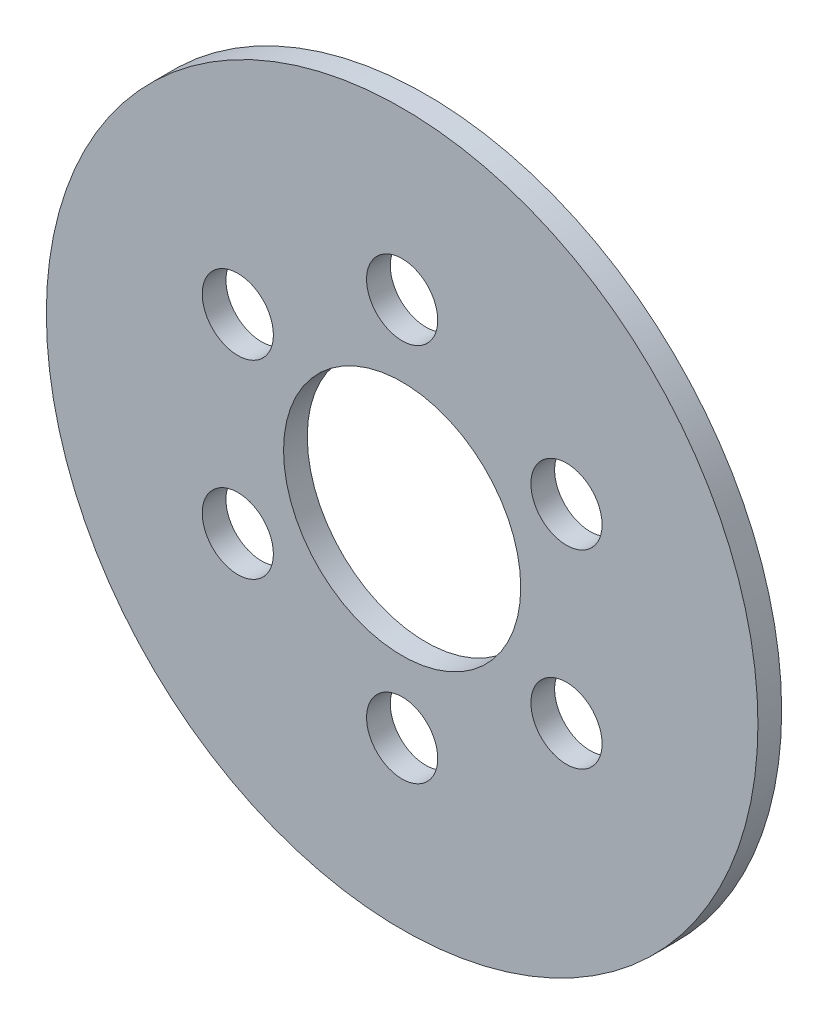
ISO-10303-21;
HEADER;
FILE_DESCRIPTION(('STEP AP214'),'2;1');
FILE_NAME('part.step','',(''),(''),'','','');
FILE_SCHEMA(('AUTOMOTIVE_DESIGN { 1 0 10303 214 1 1 1 1 }'));
ENDSEC;
DATA;
#1=APPLICATION_CONTEXT('core data for automotive mechanical design processes');
#2=APPLICATION_PROTOCOL_DEFINITION('international standard','automotive_design',2000,#1);
#3=PRODUCT_CONTEXT('',#1,'mechanical');
#4=PRODUCT('Part','Part','',(#3));
#5=PRODUCT_RELATED_PRODUCT_CATEGORY('part','',(#4));
#6=PRODUCT_DEFINITION_FORMATION('','',#4);
#7=PRODUCT_DEFINITION_CONTEXT('part definition',#1,'design');
#8=PRODUCT_DEFINITION('design','',#6,#7);
#9=PRODUCT_DEFINITION_SHAPE('','',#8);
#10=(LENGTH_UNIT() NAMED_UNIT(*) SI_UNIT(.MILLI.,.METRE.));
#11=(NAMED_UNIT(*) PLANE_ANGLE_UNIT() SI_UNIT($,.RADIAN.));
#12=(NAMED_UNIT(*) SI_UNIT($,.STERADIAN.) SOLID_ANGLE_UNIT());
#13=UNCERTAINTY_MEASURE_WITH_UNIT(LENGTH_MEASURE(1.E-05),#10,'distance_accuracy_value','');
#14=(GEOMETRIC_REPRESENTATION_CONTEXT(3) GLOBAL_UNCERTAINTY_ASSIGNED_CONTEXT((#13)) GLOBAL_UNIT_ASSIGNED_CONTEXT((#10,
#11,#12)) REPRESENTATION_CONTEXT('',''));
#15=CARTESIAN_POINT('',(0.,0.,0.));
#16=DIRECTION('',(0.,0.,1.));
#17=DIRECTION('',(1.,0.,0.));
#18=AXIS2_PLACEMENT_3D('',#15,#16,#17);
#19=CARTESIAN_POINT('',(0.,0.,1.));
#20=DIRECTION('',(0.,0.,1.));
#21=DIRECTION('',(1.,0.,0.));
#22=AXIS2_PLACEMENT_3D('',#19,#20,#21);
#23=PLANE('',#22);
#24=CARTESIAN_POINT('',(-6.92820323027551,3.99999999999999,1.));
#25=DIRECTION('',(0.,0.,1.));
#26=DIRECTION('',(1.,0.,0.));
#27=AXIS2_PLACEMENT_3D('',#24,#25,#26);
#28=CIRCLE('',#27,1.5);
#29=CARTESIAN_POINT('',(-5.42820323027551,3.99999999999999,1.));
#30=VERTEX_POINT('',#29);
#31=EDGE_CURVE('E73',#30,#30,#28,.T.);
#32=ORIENTED_EDGE('',*,*,#31,.F.);
#33=EDGE_LOOP('',(#32));
#34=FACE_BOUND('',#33,.T.);
#35=CARTESIAN_POINT('',(0.,-8.,1.));
#36=DIRECTION('',(0.,0.,1.));
#37=DIRECTION('',(1.,0.,0.));
#38=AXIS2_PLACEMENT_3D('',#35,#36,#37);
#39=CIRCLE('',#38,1.5);
#40=CARTESIAN_POINT('',(1.5,-8.,1.));
#41=VERTEX_POINT('',#40);
#42=EDGE_CURVE('E61',#41,#41,#39,.T.);
#43=ORIENTED_EDGE('',*,*,#42,.F.);
#44=EDGE_LOOP('',(#43));
#45=FACE_BOUND('',#44,.T.);
#46=CARTESIAN_POINT('',(6.92820323027551,4.,1.));
#47=DIRECTION('',(0.,0.,1.));
#48=DIRECTION('',(1.,0.,0.));
#49=AXIS2_PLACEMENT_3D('',#46,#47,#48);
#50=CIRCLE('',#49,1.5);
#51=CARTESIAN_POINT('',(8.42820323027551,4.,1.));
#52=VERTEX_POINT('',#51);
#53=EDGE_CURVE('E49',#52,#52,#50,.T.);
#54=ORIENTED_EDGE('',*,*,#53,.F.);
#55=EDGE_LOOP('',(#54));
#56=FACE_BOUND('',#55,.T.);
#57=CARTESIAN_POINT('',(0.,0.,1.));
#58=DIRECTION('',(0.,0.,1.));
#59=DIRECTION('',(1.,0.,0.));
#60=AXIS2_PLACEMENT_3D('',#57,#58,#59);
#61=CIRCLE('',#60,15.);
#62=CARTESIAN_POINT('',(15.,0.,1.));
#63=VERTEX_POINT('',#62);
#64=EDGE_CURVE('E10',#63,#63,#61,.T.);
#65=ORIENTED_EDGE('',*,*,#64,.T.);
#66=EDGE_LOOP('',(#65));
#67=FACE_BOUND('',#66,.T.);
#68=CARTESIAN_POINT('',(0.,8.,1.));
#69=DIRECTION('',(0.,0.,1.));
#70=DIRECTION('',(1.,0.,0.));
#71=AXIS2_PLACEMENT_3D('',#68,#69,#70);
#72=CIRCLE('',#71,1.5);
#73=CARTESIAN_POINT('',(1.5,8.,1.));
#74=VERTEX_POINT('',#73);
#75=EDGE_CURVE('E44',#74,#74,#72,.T.);
#76=ORIENTED_EDGE('',*,*,#75,.F.);
#77=EDGE_LOOP('',(#76));
#78=FACE_BOUND('',#77,.T.);
#79=CARTESIAN_POINT('',(6.92820323027551,-4.,1.));
#80=DIRECTION('',(0.,0.,1.));
#81=DIRECTION('',(1.,0.,0.));
#82=AXIS2_PLACEMENT_3D('',#79,#80,#81);
#83=CIRCLE('',#82,1.5);
#84=CARTESIAN_POINT('',(8.42820323027551,-4.,1.));
#85=VERTEX_POINT('',#84);
#86=EDGE_CURVE('E55',#85,#85,#83,.T.);
#87=ORIENTED_EDGE('',*,*,#86,.F.);
#88=EDGE_LOOP('',(#87));
#89=FACE_BOUND('',#88,.T.);
#90=CARTESIAN_POINT('',(-6.92820323027551,-4.,1.));
#91=DIRECTION('',(0.,0.,1.));
#92=DIRECTION('',(1.,0.,0.));
#93=AXIS2_PLACEMENT_3D('',#90,#91,#92);
#94=CIRCLE('',#93,1.5);
#95=CARTESIAN_POINT('',(-5.42820323027551,-4.,1.));
#96=VERTEX_POINT('',#95);
#97=EDGE_CURVE('E67',#96,#96,#94,.T.);
#98=ORIENTED_EDGE('',*,*,#97,.F.);
#99=EDGE_LOOP('',(#98));
#100=FACE_BOUND('',#99,.T.);
#101=CARTESIAN_POINT('',(0.,0.,1.));
#102=DIRECTION('',(0.,0.,1.));
#103=DIRECTION('',(1.,0.,0.));
#104=AXIS2_PLACEMENT_3D('',#101,#102,#103);
#105=CIRCLE('',#104,5.);
#106=CARTESIAN_POINT('',(5.,0.,1.));
#107=VERTEX_POINT('',#106);
#108=EDGE_CURVE('E79',#107,#107,#105,.T.);
#109=ORIENTED_EDGE('',*,*,#108,.F.);
#110=EDGE_LOOP('',(#109));
#111=FACE_BOUND('',#110,.T.);
#112=ADVANCED_FACE('F33',(#34,#45,#56,#67,#78,#89,#100,#111),#23,.T.);
#113=CARTESIAN_POINT('',(0.,0.,0.));
#114=DIRECTION('',(0.,0.,1.));
#115=DIRECTION('',(1.,0.,0.));
#116=AXIS2_PLACEMENT_3D('',#113,#114,#115);
#117=PLANE('',#116);
#118=CARTESIAN_POINT('',(0.,0.,0.));
#119=DIRECTION('',(0.,0.,1.));
#120=DIRECTION('',(1.,0.,0.));
#121=AXIS2_PLACEMENT_3D('',#118,#119,#120);
#122=CIRCLE('',#121,15.);
#123=CARTESIAN_POINT('',(15.,0.,0.));
#124=VERTEX_POINT('',#123);
#125=EDGE_CURVE('E37',#124,#124,#122,.T.);
#126=ORIENTED_EDGE('',*,*,#125,.F.);
#127=EDGE_LOOP('',(#126));
#128=FACE_BOUND('',#127,.T.);
#129=CARTESIAN_POINT('',(0.,8.,0.));
#130=DIRECTION('',(0.,0.,1.));
#131=DIRECTION('',(1.,0.,0.));
#132=AXIS2_PLACEMENT_3D('',#129,#130,#131);
#133=CIRCLE('',#132,1.5);
#134=CARTESIAN_POINT('',(1.5,8.,0.));
#135=VERTEX_POINT('',#134);
#136=EDGE_CURVE('E46',#135,#135,#133,.T.);
#137=ORIENTED_EDGE('',*,*,#136,.T.);
#138=EDGE_LOOP('',(#137));
#139=FACE_BOUND('',#138,.T.);
#140=CARTESIAN_POINT('',(6.92820323027551,4.,0.));
#141=DIRECTION('',(0.,0.,1.));
#142=DIRECTION('',(1.,0.,0.));
#143=AXIS2_PLACEMENT_3D('',#140,#141,#142);
#144=CIRCLE('',#143,1.5);
#145=CARTESIAN_POINT('',(8.42820323027551,4.,0.));
#146=VERTEX_POINT('',#145);
#147=EDGE_CURVE('E52',#146,#146,#144,.T.);
#148=ORIENTED_EDGE('',*,*,#147,.T.);
#149=EDGE_LOOP('',(#148));
#150=FACE_BOUND('',#149,.T.);
#151=CARTESIAN_POINT('',(6.92820323027551,-4.,0.));
#152=DIRECTION('',(0.,0.,1.));
#153=DIRECTION('',(1.,0.,0.));
#154=AXIS2_PLACEMENT_3D('',#151,#152,#153);
#155=CIRCLE('',#154,1.5);
#156=CARTESIAN_POINT('',(8.42820323027551,-4.,0.));
#157=VERTEX_POINT('',#156);
#158=EDGE_CURVE('E58',#157,#157,#155,.T.);
#159=ORIENTED_EDGE('',*,*,#158,.T.);
#160=EDGE_LOOP('',(#159));
#161=FACE_BOUND('',#160,.T.);
#162=CARTESIAN_POINT('',(0.,-8.,0.));
#163=DIRECTION('',(0.,0.,1.));
#164=DIRECTION('',(1.,0.,0.));
#165=AXIS2_PLACEMENT_3D('',#162,#163,#164);
#166=CIRCLE('',#165,1.5);
#167=CARTESIAN_POINT('',(1.5,-8.,0.));
#168=VERTEX_POINT('',#167);
#169=EDGE_CURVE('E64',#168,#168,#166,.T.);
#170=ORIENTED_EDGE('',*,*,#169,.T.);
#171=EDGE_LOOP('',(#170));
#172=FACE_BOUND('',#171,.T.);
#173=CARTESIAN_POINT('',(-6.92820323027551,-4.,0.));
#174=DIRECTION('',(0.,0.,1.));
#175=DIRECTION('',(1.,0.,0.));
#176=AXIS2_PLACEMENT_3D('',#173,#174,#175);
#177=CIRCLE('',#176,1.5);
#178=CARTESIAN_POINT('',(-5.42820323027551,-4.,0.));
#179=VERTEX_POINT('',#178);
#180=EDGE_CURVE('E70',#179,#179,#177,.T.);
#181=ORIENTED_EDGE('',*,*,#180,.T.);
#182=EDGE_LOOP('',(#181));
#183=FACE_BOUND('',#182,.T.);
#184=CARTESIAN_POINT('',(-6.92820323027551,3.99999999999999,0.));
#185=DIRECTION('',(0.,0.,1.));
#186=DIRECTION('',(1.,0.,0.));
#187=AXIS2_PLACEMENT_3D('',#184,#185,#186);
#188=CIRCLE('',#187,1.5);
#189=CARTESIAN_POINT('',(-5.42820323027551,3.99999999999999,0.));
#190=VERTEX_POINT('',#189);
#191=EDGE_CURVE('E76',#190,#190,#188,.T.);
#192=ORIENTED_EDGE('',*,*,#191,.T.);
#193=EDGE_LOOP('',(#192));
#194=FACE_BOUND('',#193,.T.);
#195=CARTESIAN_POINT('',(0.,0.,0.));
#196=DIRECTION('',(0.,0.,1.));
#197=DIRECTION('',(1.,0.,0.));
#198=AXIS2_PLACEMENT_3D('',#195,#196,#197);
#199=CIRCLE('',#198,5.);
#200=CARTESIAN_POINT('',(5.,0.,0.));
#201=VERTEX_POINT('',#200);
#202=EDGE_CURVE('E82',#201,#201,#199,.T.);
#203=ORIENTED_EDGE('',*,*,#202,.T.);
#204=EDGE_LOOP('',(#203));
#205=FACE_BOUND('',#204,.T.);
#206=ADVANCED_FACE('F92',(#128,#139,#150,#161,#172,#183,#194,#205),#117,.F.);
#207=CARTESIAN_POINT('',(0.,0.,1.));
#208=DIRECTION('',(0.,0.,-1.));
#209=DIRECTION('',(-1.,0.,0.));
#210=AXIS2_PLACEMENT_3D('',#207,#208,#209);
#211=CYLINDRICAL_SURFACE('',#210,15.);
#212=ORIENTED_EDGE('',*,*,#64,.F.);
#213=EDGE_LOOP('',(#212));
#214=FACE_BOUND('',#213,.T.);
#215=ORIENTED_EDGE('',*,*,#125,.T.);
#216=EDGE_LOOP('',(#215));
#217=FACE_BOUND('',#216,.T.);
#218=ADVANCED_FACE('F35',(#214,#217),#211,.T.);
#219=CARTESIAN_POINT('',(0.,8.,1.));
#220=DIRECTION('',(0.,0.,-1.));
#221=DIRECTION('',(-1.,0.,0.));
#222=AXIS2_PLACEMENT_3D('',#219,#220,#221);
#223=CYLINDRICAL_SURFACE('',#222,1.5);
#224=ORIENTED_EDGE('',*,*,#75,.T.);
#225=EDGE_LOOP('',(#224));
#226=FACE_BOUND('',#225,.T.);
#227=ORIENTED_EDGE('',*,*,#136,.F.);
#228=EDGE_LOOP('',(#227));
#229=FACE_BOUND('',#228,.T.);
#230=ADVANCED_FACE('F102',(#226,#229),#223,.F.);
#231=CARTESIAN_POINT('',(6.92820323027551,4.,1.));
#232=DIRECTION('',(0.,0.,-1.));
#233=DIRECTION('',(-1.,0.,0.));
#234=AXIS2_PLACEMENT_3D('',#231,#232,#233);
#235=CYLINDRICAL_SURFACE('',#234,1.5);
#236=ORIENTED_EDGE('',*,*,#53,.T.);
#237=EDGE_LOOP('',(#236));
#238=FACE_BOUND('',#237,.T.);
#239=ORIENTED_EDGE('',*,*,#147,.F.);
#240=EDGE_LOOP('',(#239));
#241=FACE_BOUND('',#240,.T.);
#242=ADVANCED_FACE('F105',(#238,#241),#235,.F.);
#243=CARTESIAN_POINT('',(6.92820323027551,-4.,1.));
#244=DIRECTION('',(0.,0.,-1.));
#245=DIRECTION('',(-1.,0.,0.));
#246=AXIS2_PLACEMENT_3D('',#243,#244,#245);
#247=CYLINDRICAL_SURFACE('',#246,1.5);
#248=ORIENTED_EDGE('',*,*,#86,.T.);
#249=EDGE_LOOP('',(#248));
#250=FACE_BOUND('',#249,.T.);
#251=ORIENTED_EDGE('',*,*,#158,.F.);
#252=EDGE_LOOP('',(#251));
#253=FACE_BOUND('',#252,.T.);
#254=ADVANCED_FACE('F109',(#250,#253),#247,.F.);
#255=CARTESIAN_POINT('',(0.,-8.,1.));
#256=DIRECTION('',(0.,0.,-1.));
#257=DIRECTION('',(-1.,0.,0.));
#258=AXIS2_PLACEMENT_3D('',#255,#256,#257);
#259=CYLINDRICAL_SURFACE('',#258,1.5);
#260=ORIENTED_EDGE('',*,*,#42,.T.);
#261=EDGE_LOOP('',(#260));
#262=FACE_BOUND('',#261,.T.);
#263=ORIENTED_EDGE('',*,*,#169,.F.);
#264=EDGE_LOOP('',(#263));
#265=FACE_BOUND('',#264,.T.);
#266=ADVANCED_FACE('F113',(#262,#265),#259,.F.);
#267=CARTESIAN_POINT('',(-6.92820323027551,-4.,1.));
#268=DIRECTION('',(0.,0.,-1.));
#269=DIRECTION('',(-1.,0.,0.));
#270=AXIS2_PLACEMENT_3D('',#267,#268,#269);
#271=CYLINDRICAL_SURFACE('',#270,1.5);
#272=ORIENTED_EDGE('',*,*,#97,.T.);
#273=EDGE_LOOP('',(#272));
#274=FACE_BOUND('',#273,.T.);
#275=ORIENTED_EDGE('',*,*,#180,.F.);
#276=EDGE_LOOP('',(#275));
#277=FACE_BOUND('',#276,.T.);
#278=ADVANCED_FACE('F117',(#274,#277),#271,.F.);
#279=CARTESIAN_POINT('',(-6.92820323027551,3.99999999999999,1.));
#280=DIRECTION('',(0.,0.,-1.));
#281=DIRECTION('',(-1.,0.,0.));
#282=AXIS2_PLACEMENT_3D('',#279,#280,#281);
#283=CYLINDRICAL_SURFACE('',#282,1.5);
#284=ORIENTED_EDGE('',*,*,#31,.T.);
#285=EDGE_LOOP('',(#284));
#286=FACE_BOUND('',#285,.T.);
#287=ORIENTED_EDGE('',*,*,#191,.F.);
#288=EDGE_LOOP('',(#287));
#289=FACE_BOUND('',#288,.T.);
#290=ADVANCED_FACE('F121',(#286,#289),#283,.F.);
#291=CARTESIAN_POINT('',(0.,0.,1.));
#292=DIRECTION('',(0.,0.,-1.));
#293=DIRECTION('',(-1.,0.,0.));
#294=AXIS2_PLACEMENT_3D('',#291,#292,#293);
#295=CYLINDRICAL_SURFACE('',#294,5.);
#296=ORIENTED_EDGE('',*,*,#108,.T.);
#297=EDGE_LOOP('',(#296));
#298=FACE_BOUND('',#297,.T.);
#299=ORIENTED_EDGE('',*,*,#202,.F.);
#300=EDGE_LOOP('',(#299));
#301=FACE_BOUND('',#300,.T.);
#302=ADVANCED_FACE('F88',(#298,#301),#295,.F.);
#303=CLOSED_SHELL('',(#112,#206,#218,#230,#242,#254,#266,#278,#290,#302));
#304=MANIFOLD_SOLID_BREP('B2',#303);
#305=ADVANCED_BREP_SHAPE_REPRESENTATION('',(#18,#304),#14);
#306=SHAPE_DEFINITION_REPRESENTATION(#9,#305);
ENDSEC;
END-ISO-10303-21;
